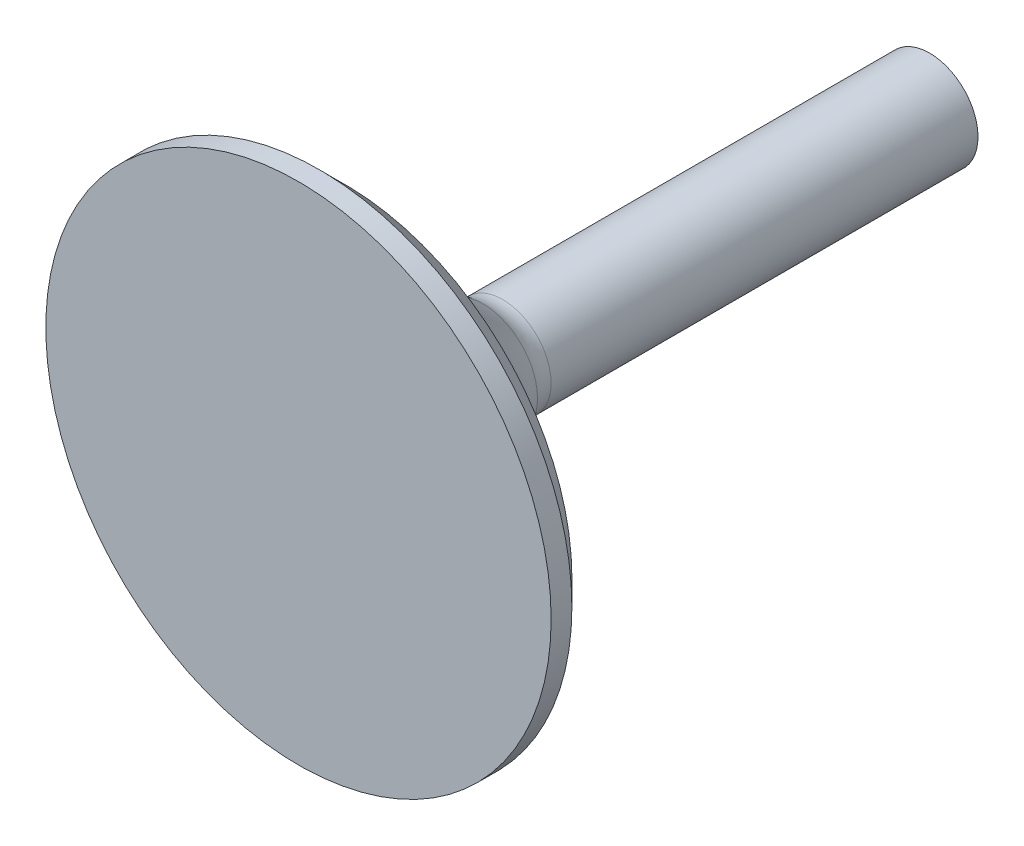
ISO-10303-21;
HEADER;
FILE_DESCRIPTION(('STEP AP214'),'2;1');
FILE_NAME('part.step','',(''),(''),'','','');
FILE_SCHEMA(('AUTOMOTIVE_DESIGN { 1 0 10303 214 1 1 1 1 }'));
ENDSEC;
DATA;
#1=APPLICATION_CONTEXT('core data for automotive mechanical design processes');
#2=APPLICATION_PROTOCOL_DEFINITION('international standard','automotive_design',2000,#1);
#3=PRODUCT_CONTEXT('',#1,'mechanical');
#4=PRODUCT('Part','Part','',(#3));
#5=PRODUCT_RELATED_PRODUCT_CATEGORY('part','',(#4));
#6=PRODUCT_DEFINITION_FORMATION('','',#4);
#7=PRODUCT_DEFINITION_CONTEXT('part definition',#1,'design');
#8=PRODUCT_DEFINITION('design','',#6,#7);
#9=PRODUCT_DEFINITION_SHAPE('','',#8);
#10=(LENGTH_UNIT() NAMED_UNIT(*) SI_UNIT(.MILLI.,.METRE.));
#11=(NAMED_UNIT(*) PLANE_ANGLE_UNIT() SI_UNIT($,.RADIAN.));
#12=(NAMED_UNIT(*) SI_UNIT($,.STERADIAN.) SOLID_ANGLE_UNIT());
#13=UNCERTAINTY_MEASURE_WITH_UNIT(LENGTH_MEASURE(1.E-05),#10,'distance_accuracy_value','');
#14=(GEOMETRIC_REPRESENTATION_CONTEXT(3) GLOBAL_UNCERTAINTY_ASSIGNED_CONTEXT((#13)) GLOBAL_UNIT_ASSIGNED_CONTEXT((#10,
#11,#12)) REPRESENTATION_CONTEXT('',''));
#15=CARTESIAN_POINT('',(0.,0.,0.));
#16=DIRECTION('',(0.,0.,1.));
#17=DIRECTION('',(1.,0.,0.));
#18=AXIS2_PLACEMENT_3D('',#15,#16,#17);
#19=CARTESIAN_POINT('',(0.,0.,25.5720914640249));
#20=DIRECTION('',(0.,0.,1.));
#21=DIRECTION('',(1.,0.,0.));
#22=AXIS2_PLACEMENT_3D('',#19,#20,#21);
#23=PLANE('',#22);
#24=CARTESIAN_POINT('',(0.,0.,25.5720914640249));
#25=DIRECTION('',(0.,0.,1.));
#26=DIRECTION('',(1.,0.,0.));
#27=AXIS2_PLACEMENT_3D('',#24,#25,#26);
#28=CIRCLE('',#27,18.57375);
#29=CARTESIAN_POINT('',(18.57375,0.,25.5720914640249));
#30=VERTEX_POINT('',#29);
#31=EDGE_CURVE('E10',#30,#30,#28,.T.);
#32=ORIENTED_EDGE('',*,*,#31,.T.);
#33=EDGE_LOOP('',(#32));
#34=FACE_BOUND('',#33,.T.);
#35=ADVANCED_FACE('F30',(#34),#23,.T.);
#36=CARTESIAN_POINT('',(0.,0.,25.5720914640249));
#37=DIRECTION('',(0.,0.,1.));
#38=DIRECTION('',(1.,0.,0.));
#39=AXIS2_PLACEMENT_3D('',#36,#37,#38);
#40=CYLINDRICAL_SURFACE('',#39,18.57375);
#41=CARTESIAN_POINT('',(0.,0.,24.0466416651913));
#42=DIRECTION('',(0.,0.,1.));
#43=DIRECTION('',(1.,0.,0.));
#44=AXIS2_PLACEMENT_3D('',#41,#42,#43);
#45=CIRCLE('',#44,18.57375);
#46=CARTESIAN_POINT('',(18.57375,0.,24.0466416651913));
#47=VERTEX_POINT('',#46);
#48=EDGE_CURVE('E36',#47,#47,#45,.T.);
#49=ORIENTED_EDGE('',*,*,#48,.T.);
#50=EDGE_LOOP('',(#49));
#51=FACE_BOUND('',#50,.T.);
#52=ORIENTED_EDGE('',*,*,#31,.F.);
#53=EDGE_LOOP('',(#52));
#54=FACE_BOUND('',#53,.T.);
#55=ADVANCED_FACE('F71',(#51,#54),#40,.T.);
#56=CARTESIAN_POINT('',(0.,0.,24.0466416651913));
#57=DIRECTION('',(0.,0.,1.));
#58=DIRECTION('',(1.,0.,0.));
#59=AXIS2_PLACEMENT_3D('',#56,#57,#58);
#60=CONICAL_SURFACE('',#59,18.57375,0.785398163397454);
#61=CARTESIAN_POINT('',(0.,0.,22.1575166651913));
#62=DIRECTION('',(0.,0.,1.));
#63=DIRECTION('',(1.,0.,0.));
#64=AXIS2_PLACEMENT_3D('',#61,#62,#63);
#65=CIRCLE('',#64,16.684625);
#66=CARTESIAN_POINT('',(16.684625,0.,22.1575166651913));
#67=VERTEX_POINT('',#66);
#68=EDGE_CURVE('E40',#67,#67,#65,.T.);
#69=ORIENTED_EDGE('',*,*,#68,.T.);
#70=EDGE_LOOP('',(#69));
#71=FACE_BOUND('',#70,.T.);
#72=ORIENTED_EDGE('',*,*,#48,.F.);
#73=EDGE_LOOP('',(#72));
#74=FACE_BOUND('',#73,.T.);
#75=ADVANCED_FACE('F67',(#71,#74),#60,.T.);
#76=CARTESIAN_POINT('',(16.684625,0.,22.1575166651913));
#77=CARTESIAN_POINT('',(11.4681086725254,0.,19.9625440785412));
#78=CARTESIAN_POINT('',(7.2259558773867,0.,16.5649242605851));
#79=CARTESIAN_POINT('',(4.02065289835578,0.,12.0224411554089));
#80=B_SPLINE_CURVE_WITH_KNOTS('',3,(#76,#77,#78,#79),.UNSPECIFIED.,.F.,.F.,(4,4),(0.,
0.953211625740174),.UNSPECIFIED.);
#81=CARTESIAN_POINT('',(0.,0.,25.5720914640249));
#82=DIRECTION('',(0.,0.,1.));
#83=AXIS1_PLACEMENT('',#81,#82);
#84=SURFACE_OF_REVOLUTION('',#80,#83);
#85=CARTESIAN_POINT('',(0.,0.,12.0224411554089));
#86=DIRECTION('',(0.,0.,1.));
#87=DIRECTION('',(1.,0.,0.));
#88=AXIS2_PLACEMENT_3D('',#85,#86,#87);
#89=CIRCLE('',#88,4.02065289835578);
#90=CARTESIAN_POINT('',(4.02065289835578,0.,12.0224411554089));
#91=VERTEX_POINT('',#90);
#92=EDGE_CURVE('E44',#91,#91,#89,.T.);
#93=ORIENTED_EDGE('',*,*,#92,.T.);
#94=EDGE_LOOP('',(#93));
#95=FACE_BOUND('',#94,.T.);
#96=ORIENTED_EDGE('',*,*,#68,.F.);
#97=EDGE_LOOP('',(#96));
#98=FACE_BOUND('',#97,.T.);
#99=ADVANCED_FACE('F62',(#95,#98),#84,.F.);
#100=CARTESIAN_POINT('',(0.,0.,10.558018263039));
#101=DIRECTION('',(0.,0.,1.));
#102=DIRECTION('',(1.,0.,0.));
#103=AXIS2_PLACEMENT_3D('',#100,#101,#102);
#104=TOROIDAL_SURFACE('',#103,6.096,2.54);
#105=CARTESIAN_POINT('',(0.,0.,10.558018263039));
#106=DIRECTION('',(0.,0.,1.));
#107=DIRECTION('',(1.,0.,0.));
#108=AXIS2_PLACEMENT_3D('',#105,#106,#107);
#109=CIRCLE('',#108,3.556);
#110=CARTESIAN_POINT('',(3.556,0.,10.558018263039));
#111=VERTEX_POINT('',#110);
#112=EDGE_CURVE('E49',#111,#111,#109,.T.);
#113=ORIENTED_EDGE('',*,*,#112,.T.);
#114=EDGE_LOOP('',(#113));
#115=FACE_BOUND('',#114,.T.);
#116=ORIENTED_EDGE('',*,*,#92,.F.);
#117=EDGE_LOOP('',(#116));
#118=FACE_BOUND('',#117,.T.);
#119=ADVANCED_FACE('F66',(#115,#118),#104,.F.);
#120=CARTESIAN_POINT('',(0.,0.,25.5720914640249));
#121=DIRECTION('',(0.,0.,1.));
#122=DIRECTION('',(1.,0.,0.));
#123=AXIS2_PLACEMENT_3D('',#120,#121,#122);
#124=CYLINDRICAL_SURFACE('',#123,3.556);
#125=CARTESIAN_POINT('',(0.,0.,-20.8231718258906));
#126=DIRECTION('',(0.,0.,1.));
#127=DIRECTION('',(1.,0.,0.));
#128=AXIS2_PLACEMENT_3D('',#125,#126,#127);
#129=CIRCLE('',#128,3.556);
#130=CARTESIAN_POINT('',(3.556,0.,-20.8231718258906));
#131=VERTEX_POINT('',#130);
#132=EDGE_CURVE('E52',#131,#131,#129,.T.);
#133=ORIENTED_EDGE('',*,*,#132,.T.);
#134=EDGE_LOOP('',(#133));
#135=FACE_BOUND('',#134,.T.);
#136=ORIENTED_EDGE('',*,*,#112,.F.);
#137=EDGE_LOOP('',(#136));
#138=FACE_BOUND('',#137,.T.);
#139=ADVANCED_FACE('F105',(#135,#138),#124,.T.);
#140=CARTESIAN_POINT('',(0.,0.,-20.8231718258906));
#141=DIRECTION('',(0.,0.,-1.));
#142=DIRECTION('',(-1.,0.,0.));
#143=AXIS2_PLACEMENT_3D('',#140,#141,#142);
#144=PLANE('',#143);
#145=ORIENTED_EDGE('',*,*,#132,.F.);
#146=EDGE_LOOP('',(#145));
#147=FACE_BOUND('',#146,.T.);
#148=ADVANCED_FACE('F114',(#147),#144,.T.);
#149=CLOSED_SHELL('',(#35,#55,#75,#99,#119,#139,#148));
#150=MANIFOLD_SOLID_BREP('B2',#149);
#151=ADVANCED_BREP_SHAPE_REPRESENTATION('',(#18,#150),#14);
#152=SHAPE_DEFINITION_REPRESENTATION(#9,#151);
ENDSEC;
END-ISO-10303-21;
